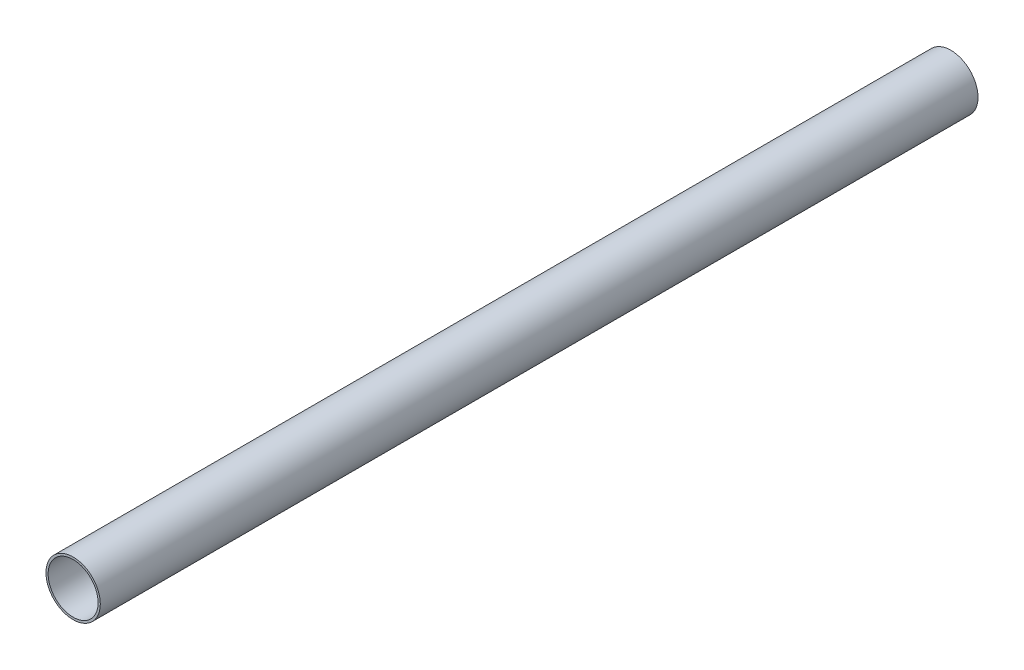
ISO-10303-21;
HEADER;
FILE_DESCRIPTION(('STEP AP214'),'2;1');
FILE_NAME('part.step','',(''),(''),'','','');
FILE_SCHEMA(('AUTOMOTIVE_DESIGN { 1 0 10303 214 1 1 1 1 }'));
ENDSEC;
DATA;
#1=APPLICATION_CONTEXT('core data for automotive mechanical design processes');
#2=APPLICATION_PROTOCOL_DEFINITION('international standard','automotive_design',2000,#1);
#3=PRODUCT_CONTEXT('',#1,'mechanical');
#4=PRODUCT('Part','Part','',(#3));
#5=PRODUCT_RELATED_PRODUCT_CATEGORY('part','',(#4));
#6=PRODUCT_DEFINITION_FORMATION('','',#4);
#7=PRODUCT_DEFINITION_CONTEXT('part definition',#1,'design');
#8=PRODUCT_DEFINITION('design','',#6,#7);
#9=PRODUCT_DEFINITION_SHAPE('','',#8);
#10=(LENGTH_UNIT() NAMED_UNIT(*) SI_UNIT(.MILLI.,.METRE.));
#11=(NAMED_UNIT(*) PLANE_ANGLE_UNIT() SI_UNIT($,.RADIAN.));
#12=(NAMED_UNIT(*) SI_UNIT($,.STERADIAN.) SOLID_ANGLE_UNIT());
#13=UNCERTAINTY_MEASURE_WITH_UNIT(LENGTH_MEASURE(1.E-05),#10,'distance_accuracy_value','');
#14=(GEOMETRIC_REPRESENTATION_CONTEXT(3) GLOBAL_UNCERTAINTY_ASSIGNED_CONTEXT((#13)) GLOBAL_UNIT_ASSIGNED_CONTEXT((#10,
#11,#12)) REPRESENTATION_CONTEXT('',''));
#15=CARTESIAN_POINT('',(0.,0.,0.));
#16=DIRECTION('',(0.,0.,1.));
#17=DIRECTION('',(1.,0.,0.));
#18=AXIS2_PLACEMENT_3D('',#15,#16,#17);
#19=CARTESIAN_POINT('',(0.,0.,403.72));
#20=DIRECTION('',(0.,0.,1.));
#21=DIRECTION('',(1.,0.,0.));
#22=AXIS2_PLACEMENT_3D('',#19,#20,#21);
#23=PLANE('',#22);
#24=CARTESIAN_POINT('',(0.,0.,403.72));
#25=DIRECTION('',(0.,0.,1.));
#26=DIRECTION('',(1.,0.,0.));
#27=AXIS2_PLACEMENT_3D('',#24,#25,#26);
#28=CIRCLE('',#27,12.5);
#29=CARTESIAN_POINT('',(12.5,0.,403.72));
#30=VERTEX_POINT('',#29);
#31=EDGE_CURVE('E10',#30,#30,#28,.T.);
#32=ORIENTED_EDGE('',*,*,#31,.T.);
#33=EDGE_LOOP('',(#32));
#34=FACE_BOUND('',#33,.T.);
#35=CARTESIAN_POINT('',(0.,0.,403.72));
#36=DIRECTION('',(0.,0.,1.));
#37=DIRECTION('',(1.,0.,0.));
#38=AXIS2_PLACEMENT_3D('',#35,#36,#37);
#39=CIRCLE('',#38,11.5);
#40=CARTESIAN_POINT('',(11.5,0.,403.72));
#41=VERTEX_POINT('',#40);
#42=EDGE_CURVE('E48',#41,#41,#39,.T.);
#43=ORIENTED_EDGE('',*,*,#42,.F.);
#44=EDGE_LOOP('',(#43));
#45=FACE_BOUND('',#44,.T.);
#46=ADVANCED_FACE('F36',(#34,#45),#23,.T.);
#47=CARTESIAN_POINT('',(0.,0.,0.));
#48=DIRECTION('',(0.,0.,1.));
#49=DIRECTION('',(1.,0.,0.));
#50=AXIS2_PLACEMENT_3D('',#47,#48,#49);
#51=PLANE('',#50);
#52=CARTESIAN_POINT('',(0.,0.,0.));
#53=DIRECTION('',(0.,0.,1.));
#54=DIRECTION('',(1.,0.,0.));
#55=AXIS2_PLACEMENT_3D('',#52,#53,#54);
#56=CIRCLE('',#55,12.5);
#57=CARTESIAN_POINT('',(12.5,0.,0.));
#58=VERTEX_POINT('',#57);
#59=EDGE_CURVE('E40',#58,#58,#56,.T.);
#60=ORIENTED_EDGE('',*,*,#59,.F.);
#61=EDGE_LOOP('',(#60));
#62=FACE_BOUND('',#61,.T.);
#63=CARTESIAN_POINT('',(0.,0.,0.));
#64=DIRECTION('',(0.,0.,1.));
#65=DIRECTION('',(1.,0.,0.));
#66=AXIS2_PLACEMENT_3D('',#63,#64,#65);
#67=CIRCLE('',#66,11.5);
#68=CARTESIAN_POINT('',(11.5,0.,0.));
#69=VERTEX_POINT('',#68);
#70=EDGE_CURVE('E50',#69,#69,#67,.T.);
#71=ORIENTED_EDGE('',*,*,#70,.T.);
#72=EDGE_LOOP('',(#71));
#73=FACE_BOUND('',#72,.T.);
#74=ADVANCED_FACE('F61',(#62,#73),#51,.F.);
#75=CARTESIAN_POINT('',(0.,0.,403.72));
#76=DIRECTION('',(0.,0.,-1.));
#77=DIRECTION('',(-1.,0.,0.));
#78=AXIS2_PLACEMENT_3D('',#75,#76,#77);
#79=CYLINDRICAL_SURFACE('',#78,12.5);
#80=ORIENTED_EDGE('',*,*,#31,.F.);
#81=EDGE_LOOP('',(#80));
#82=FACE_BOUND('',#81,.T.);
#83=ORIENTED_EDGE('',*,*,#59,.T.);
#84=EDGE_LOOP('',(#83));
#85=FACE_BOUND('',#84,.T.);
#86=ADVANCED_FACE('F38',(#82,#85),#79,.T.);
#87=CARTESIAN_POINT('',(0.,0.,403.72));
#88=DIRECTION('',(0.,0.,-1.));
#89=DIRECTION('',(-1.,0.,0.));
#90=AXIS2_PLACEMENT_3D('',#87,#88,#89);
#91=CYLINDRICAL_SURFACE('',#90,11.5);
#92=ORIENTED_EDGE('',*,*,#42,.T.);
#93=EDGE_LOOP('',(#92));
#94=FACE_BOUND('',#93,.T.);
#95=ORIENTED_EDGE('',*,*,#70,.F.);
#96=EDGE_LOOP('',(#95));
#97=FACE_BOUND('',#96,.T.);
#98=ADVANCED_FACE('F57',(#94,#97),#91,.F.);
#99=CLOSED_SHELL('',(#46,#74,#86,#98));
#100=MANIFOLD_SOLID_BREP('B2',#99);
#101=ADVANCED_BREP_SHAPE_REPRESENTATION('',(#18,#100),#14);
#102=SHAPE_DEFINITION_REPRESENTATION(#9,#101);
ENDSEC;
END-ISO-10303-21;
